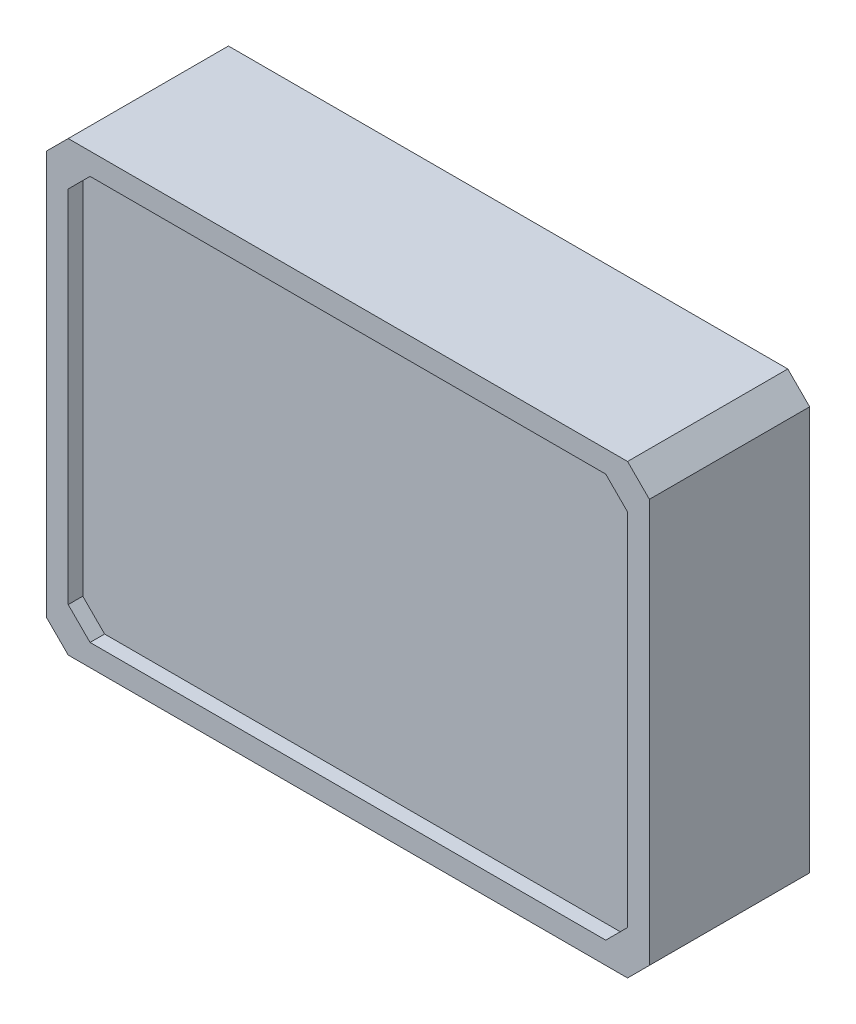
ISO-10303-21;
HEADER;
FILE_DESCRIPTION(('STEP AP214'),'2;1');
FILE_NAME('part.step','',(''),(''),'','','');
FILE_SCHEMA(('AUTOMOTIVE_DESIGN { 1 0 10303 214 1 1 1 1 }'));
ENDSEC;
DATA;
#1=APPLICATION_CONTEXT('core data for automotive mechanical design processes');
#2=APPLICATION_PROTOCOL_DEFINITION('international standard','automotive_design',2000,#1);
#3=PRODUCT_CONTEXT('',#1,'mechanical');
#4=PRODUCT('Part','Part','',(#3));
#5=PRODUCT_RELATED_PRODUCT_CATEGORY('part','',(#4));
#6=PRODUCT_DEFINITION_FORMATION('','',#4);
#7=PRODUCT_DEFINITION_CONTEXT('part definition',#1,'design');
#8=PRODUCT_DEFINITION('design','',#6,#7);
#9=PRODUCT_DEFINITION_SHAPE('','',#8);
#10=(LENGTH_UNIT() NAMED_UNIT(*) SI_UNIT(.MILLI.,.METRE.));
#11=(NAMED_UNIT(*) PLANE_ANGLE_UNIT() SI_UNIT($,.RADIAN.));
#12=(NAMED_UNIT(*) SI_UNIT($,.STERADIAN.) SOLID_ANGLE_UNIT());
#13=UNCERTAINTY_MEASURE_WITH_UNIT(LENGTH_MEASURE(1.E-05),#10,'distance_accuracy_value','');
#14=(GEOMETRIC_REPRESENTATION_CONTEXT(3) GLOBAL_UNCERTAINTY_ASSIGNED_CONTEXT((#13)) GLOBAL_UNIT_ASSIGNED_CONTEXT((#10,
#11,#12)) REPRESENTATION_CONTEXT('',''));
#15=CARTESIAN_POINT('',(0.,0.,0.));
#16=DIRECTION('',(0.,0.,1.));
#17=DIRECTION('',(1.,0.,0.));
#18=AXIS2_PLACEMENT_3D('',#15,#16,#17);
#19=CARTESIAN_POINT('',(-41.4,-27.7095,20.));
#20=DIRECTION('',(0.707106781186547,0.707106781186548,0.));
#21=DIRECTION('',(-0.707106781186548,0.707106781186547,0.));
#22=AXIS2_PLACEMENT_3D('',#19,#20,#21);
#23=PLANE('',#22);
#24=DIRECTION('',(0.707106781186548,-0.707106781186547,0.));
#25=VECTOR('',#24,1.);
#26=CARTESIAN_POINT('',(-41.4,-27.7095,0.));
#27=LINE('',#26,#25);
#28=CARTESIAN_POINT('',(-41.4,-27.7095,0.));
#29=VERTEX_POINT('',#28);
#30=CARTESIAN_POINT('',(-38.4,-30.7095,0.));
#31=VERTEX_POINT('',#30);
#32=EDGE_CURVE('E243',#29,#31,#27,.T.);
#33=ORIENTED_EDGE('',*,*,#32,.T.);
#34=DIRECTION('',(0.,0.,-1.));
#35=VECTOR('',#34,1.);
#36=CARTESIAN_POINT('',(-38.4,-30.7095,20.));
#37=LINE('',#36,#35);
#38=CARTESIAN_POINT('',(-38.4,-30.7095,22.));
#39=VERTEX_POINT('',#38);
#40=EDGE_CURVE('E11',#39,#31,#37,.T.);
#41=ORIENTED_EDGE('',*,*,#40,.F.);
#42=DIRECTION('',(0.707106781186548,-0.707106781186547,0.));
#43=VECTOR('',#42,1.);
#44=CARTESIAN_POINT('',(-41.4,-27.7095,22.));
#45=LINE('',#44,#43);
#46=CARTESIAN_POINT('',(-41.4,-27.7095,22.));
#47=VERTEX_POINT('',#46);
#48=EDGE_CURVE('E169',#47,#39,#45,.T.);
#49=ORIENTED_EDGE('',*,*,#48,.F.);
#50=DIRECTION('',(0.,0.,-1.));
#51=VECTOR('',#50,1.);
#52=CARTESIAN_POINT('',(-41.4,-27.7095,20.));
#53=LINE('',#52,#51);
#54=EDGE_CURVE('E260',#47,#29,#53,.T.);
#55=ORIENTED_EDGE('',*,*,#54,.T.);
#56=EDGE_LOOP('',(#33,#41,#49,#55));
#57=FACE_BOUND('',#56,.T.);
#58=ADVANCED_FACE('F43',(#57),#23,.F.);
#59=CARTESIAN_POINT('',(-38.4,-30.7095,20.));
#60=DIRECTION('',(0.,1.,0.));
#61=DIRECTION('',(0.,0.,1.));
#62=AXIS2_PLACEMENT_3D('',#59,#60,#61);
#63=PLANE('',#62);
#64=DIRECTION('',(1.,0.,0.));
#65=VECTOR('',#64,1.);
#66=CARTESIAN_POINT('',(-38.4,-30.7095,0.));
#67=LINE('',#66,#65);
#68=CARTESIAN_POINT('',(38.4,-30.7095,0.));
#69=VERTEX_POINT('',#68);
#70=EDGE_CURVE('E246',#31,#69,#67,.T.);
#71=ORIENTED_EDGE('',*,*,#70,.T.);
#72=DIRECTION('',(0.,0.,-1.));
#73=VECTOR('',#72,1.);
#74=CARTESIAN_POINT('',(38.4,-30.7095,20.));
#75=LINE('',#74,#73);
#76=CARTESIAN_POINT('',(38.4,-30.7095,22.));
#77=VERTEX_POINT('',#76);
#78=EDGE_CURVE('E50',#77,#69,#75,.T.);
#79=ORIENTED_EDGE('',*,*,#78,.F.);
#80=DIRECTION('',(1.,0.,0.));
#81=VECTOR('',#80,1.);
#82=CARTESIAN_POINT('',(-38.4,-30.7095,22.));
#83=LINE('',#82,#81);
#84=EDGE_CURVE('E222',#39,#77,#83,.T.);
#85=ORIENTED_EDGE('',*,*,#84,.F.);
#86=ORIENTED_EDGE('',*,*,#40,.T.);
#87=EDGE_LOOP('',(#71,#79,#85,#86));
#88=FACE_BOUND('',#87,.T.);
#89=ADVANCED_FACE('F310',(#88),#63,.F.);
#90=CARTESIAN_POINT('',(38.4,-30.7095,20.));
#91=DIRECTION('',(-0.707106781186547,0.707106781186548,0.));
#92=DIRECTION('',(-0.707106781186548,-0.707106781186547,0.));
#93=AXIS2_PLACEMENT_3D('',#90,#91,#92);
#94=PLANE('',#93);
#95=DIRECTION('',(0.707106781186548,0.707106781186547,0.));
#96=VECTOR('',#95,1.);
#97=CARTESIAN_POINT('',(38.4,-30.7095,0.));
#98=LINE('',#97,#96);
#99=CARTESIAN_POINT('',(41.4,-27.7095,0.));
#100=VERTEX_POINT('',#99);
#101=EDGE_CURVE('E248',#69,#100,#98,.T.);
#102=ORIENTED_EDGE('',*,*,#101,.T.);
#103=DIRECTION('',(0.,0.,-1.));
#104=VECTOR('',#103,1.);
#105=CARTESIAN_POINT('',(41.4,-27.7095,20.));
#106=LINE('',#105,#104);
#107=CARTESIAN_POINT('',(41.4,-27.7095,22.));
#108=VERTEX_POINT('',#107);
#109=EDGE_CURVE('E275',#108,#100,#106,.T.);
#110=ORIENTED_EDGE('',*,*,#109,.F.);
#111=DIRECTION('',(0.707106781186548,0.707106781186547,0.));
#112=VECTOR('',#111,1.);
#113=CARTESIAN_POINT('',(38.4,-30.7095,22.));
#114=LINE('',#113,#112);
#115=EDGE_CURVE('E225',#77,#108,#114,.T.);
#116=ORIENTED_EDGE('',*,*,#115,.F.);
#117=ORIENTED_EDGE('',*,*,#78,.T.);
#118=EDGE_LOOP('',(#102,#110,#116,#117));
#119=FACE_BOUND('',#118,.T.);
#120=ADVANCED_FACE('F281',(#119),#94,.F.);
#121=CARTESIAN_POINT('',(41.4,-27.7095,20.));
#122=DIRECTION('',(-1.,0.,0.));
#123=DIRECTION('',(0.,0.,1.));
#124=AXIS2_PLACEMENT_3D('',#121,#122,#123);
#125=PLANE('',#124);
#126=DIRECTION('',(0.,1.,0.));
#127=VECTOR('',#126,1.);
#128=CARTESIAN_POINT('',(41.4,-27.7095,0.));
#129=LINE('',#128,#127);
#130=CARTESIAN_POINT('',(41.4,27.7095,0.));
#131=VERTEX_POINT('',#130);
#132=EDGE_CURVE('E250',#100,#131,#129,.T.);
#133=ORIENTED_EDGE('',*,*,#132,.T.);
#134=DIRECTION('',(0.,0.,-1.));
#135=VECTOR('',#134,1.);
#136=CARTESIAN_POINT('',(41.4,27.7095,20.));
#137=LINE('',#136,#135);
#138=CARTESIAN_POINT('',(41.4,27.7095,22.));
#139=VERTEX_POINT('',#138);
#140=EDGE_CURVE('E272',#139,#131,#137,.T.);
#141=ORIENTED_EDGE('',*,*,#140,.F.);
#142=DIRECTION('',(0.,1.,0.));
#143=VECTOR('',#142,1.);
#144=CARTESIAN_POINT('',(41.4,-27.7095,22.));
#145=LINE('',#144,#143);
#146=EDGE_CURVE('E228',#108,#139,#145,.T.);
#147=ORIENTED_EDGE('',*,*,#146,.F.);
#148=ORIENTED_EDGE('',*,*,#109,.T.);
#149=EDGE_LOOP('',(#133,#141,#147,#148));
#150=FACE_BOUND('',#149,.T.);
#151=ADVANCED_FACE('F291',(#150),#125,.F.);
#152=CARTESIAN_POINT('',(41.4,27.7095,20.));
#153=DIRECTION('',(-0.707106781186547,-0.707106781186548,0.));
#154=DIRECTION('',(0.707106781186548,-0.707106781186547,0.));
#155=AXIS2_PLACEMENT_3D('',#152,#153,#154);
#156=PLANE('',#155);
#157=DIRECTION('',(-0.707106781186548,0.707106781186547,0.));
#158=VECTOR('',#157,1.);
#159=CARTESIAN_POINT('',(41.4,27.7095,0.));
#160=LINE('',#159,#158);
#161=CARTESIAN_POINT('',(38.4,30.7095,0.));
#162=VERTEX_POINT('',#161);
#163=EDGE_CURVE('E252',#131,#162,#160,.T.);
#164=ORIENTED_EDGE('',*,*,#163,.T.);
#165=DIRECTION('',(0.,0.,-1.));
#166=VECTOR('',#165,1.);
#167=CARTESIAN_POINT('',(38.4,30.7095,20.));
#168=LINE('',#167,#166);
#169=CARTESIAN_POINT('',(38.4,30.7095,22.));
#170=VERTEX_POINT('',#169);
#171=EDGE_CURVE('E269',#170,#162,#168,.T.);
#172=ORIENTED_EDGE('',*,*,#171,.F.);
#173=DIRECTION('',(-0.707106781186548,0.707106781186547,0.));
#174=VECTOR('',#173,1.);
#175=CARTESIAN_POINT('',(41.4,27.7095,22.));
#176=LINE('',#175,#174);
#177=EDGE_CURVE('E231',#139,#170,#176,.T.);
#178=ORIENTED_EDGE('',*,*,#177,.F.);
#179=ORIENTED_EDGE('',*,*,#140,.T.);
#180=EDGE_LOOP('',(#164,#172,#178,#179));
#181=FACE_BOUND('',#180,.T.);
#182=ADVANCED_FACE('F295',(#181),#156,.F.);
#183=CARTESIAN_POINT('',(38.4,30.7095,20.));
#184=DIRECTION('',(0.,-1.,0.));
#185=DIRECTION('',(0.,0.,-1.));
#186=AXIS2_PLACEMENT_3D('',#183,#184,#185);
#187=PLANE('',#186);
#188=DIRECTION('',(-1.,0.,0.));
#189=VECTOR('',#188,1.);
#190=CARTESIAN_POINT('',(38.4,30.7095,0.));
#191=LINE('',#190,#189);
#192=CARTESIAN_POINT('',(-38.4,30.7095,0.));
#193=VERTEX_POINT('',#192);
#194=EDGE_CURVE('E254',#162,#193,#191,.T.);
#195=ORIENTED_EDGE('',*,*,#194,.T.);
#196=DIRECTION('',(0.,0.,-1.));
#197=VECTOR('',#196,1.);
#198=CARTESIAN_POINT('',(-38.4,30.7095,20.));
#199=LINE('',#198,#197);
#200=CARTESIAN_POINT('',(-38.4,30.7095,22.));
#201=VERTEX_POINT('',#200);
#202=EDGE_CURVE('E266',#201,#193,#199,.T.);
#203=ORIENTED_EDGE('',*,*,#202,.F.);
#204=DIRECTION('',(-1.,0.,0.));
#205=VECTOR('',#204,1.);
#206=CARTESIAN_POINT('',(38.4,30.7095,22.));
#207=LINE('',#206,#205);
#208=EDGE_CURVE('E234',#170,#201,#207,.T.);
#209=ORIENTED_EDGE('',*,*,#208,.F.);
#210=ORIENTED_EDGE('',*,*,#171,.T.);
#211=EDGE_LOOP('',(#195,#203,#209,#210));
#212=FACE_BOUND('',#211,.T.);
#213=ADVANCED_FACE('F300',(#212),#187,.F.);
#214=CARTESIAN_POINT('',(-38.4,30.7095,20.));
#215=DIRECTION('',(0.707106781186547,-0.707106781186548,0.));
#216=DIRECTION('',(0.707106781186548,0.707106781186547,0.));
#217=AXIS2_PLACEMENT_3D('',#214,#215,#216);
#218=PLANE('',#217);
#219=DIRECTION('',(-0.707106781186548,-0.707106781186547,0.));
#220=VECTOR('',#219,1.);
#221=CARTESIAN_POINT('',(-38.4,30.7095,0.));
#222=LINE('',#221,#220);
#223=CARTESIAN_POINT('',(-41.4,27.7095,0.));
#224=VERTEX_POINT('',#223);
#225=EDGE_CURVE('E256',#193,#224,#222,.T.);
#226=ORIENTED_EDGE('',*,*,#225,.T.);
#227=DIRECTION('',(0.,0.,-1.));
#228=VECTOR('',#227,1.);
#229=CARTESIAN_POINT('',(-41.4,27.7095,20.));
#230=LINE('',#229,#228);
#231=CARTESIAN_POINT('',(-41.4,27.7095,22.));
#232=VERTEX_POINT('',#231);
#233=EDGE_CURVE('E263',#232,#224,#230,.T.);
#234=ORIENTED_EDGE('',*,*,#233,.F.);
#235=DIRECTION('',(-0.707106781186548,-0.707106781186547,0.));
#236=VECTOR('',#235,1.);
#237=CARTESIAN_POINT('',(-38.4,30.7095,22.));
#238=LINE('',#237,#236);
#239=EDGE_CURVE('E237',#201,#232,#238,.T.);
#240=ORIENTED_EDGE('',*,*,#239,.F.);
#241=ORIENTED_EDGE('',*,*,#202,.T.);
#242=EDGE_LOOP('',(#226,#234,#240,#241));
#243=FACE_BOUND('',#242,.T.);
#244=ADVANCED_FACE('F303',(#243),#218,.F.);
#245=CARTESIAN_POINT('',(-41.4,27.7095,20.));
#246=DIRECTION('',(1.,0.,0.));
#247=DIRECTION('',(0.,0.,-1.));
#248=AXIS2_PLACEMENT_3D('',#245,#246,#247);
#249=PLANE('',#248);
#250=DIRECTION('',(0.,-1.,0.));
#251=VECTOR('',#250,1.);
#252=CARTESIAN_POINT('',(-41.4,27.7095,0.));
#253=LINE('',#252,#251);
#254=EDGE_CURVE('E258',#224,#29,#253,.T.);
#255=ORIENTED_EDGE('',*,*,#254,.T.);
#256=ORIENTED_EDGE('',*,*,#54,.F.);
#257=DIRECTION('',(0.,-1.,0.));
#258=VECTOR('',#257,1.);
#259=CARTESIAN_POINT('',(-41.4,27.7095,22.));
#260=LINE('',#259,#258);
#261=EDGE_CURVE('E240',#232,#47,#260,.T.);
#262=ORIENTED_EDGE('',*,*,#261,.F.);
#263=ORIENTED_EDGE('',*,*,#233,.T.);
#264=EDGE_LOOP('',(#255,#256,#262,#263));
#265=FACE_BOUND('',#264,.T.);
#266=ADVANCED_FACE('F306',(#265),#249,.F.);
#267=CARTESIAN_POINT('',(0.,0.,0.));
#268=DIRECTION('',(0.,0.,1.));
#269=DIRECTION('',(1.,0.,0.));
#270=AXIS2_PLACEMENT_3D('',#267,#268,#269);
#271=PLANE('',#270);
#272=ORIENTED_EDGE('',*,*,#32,.F.);
#273=ORIENTED_EDGE('',*,*,#254,.F.);
#274=ORIENTED_EDGE('',*,*,#225,.F.);
#275=ORIENTED_EDGE('',*,*,#194,.F.);
#276=ORIENTED_EDGE('',*,*,#163,.F.);
#277=ORIENTED_EDGE('',*,*,#132,.F.);
#278=ORIENTED_EDGE('',*,*,#101,.F.);
#279=ORIENTED_EDGE('',*,*,#70,.F.);
#280=EDGE_LOOP('',(#272,#273,#274,#275,#276,#277,#278,#279));
#281=FACE_BOUND('',#280,.T.);
#282=ADVANCED_FACE('F287',(#281),#271,.F.);
#283=CARTESIAN_POINT('',(0.,0.,22.));
#284=DIRECTION('',(0.,0.,1.));
#285=DIRECTION('',(1.,0.,0.));
#286=AXIS2_PLACEMENT_3D('',#283,#284,#285);
#287=PLANE('',#286);
#288=ORIENTED_EDGE('',*,*,#48,.T.);
#289=ORIENTED_EDGE('',*,*,#84,.T.);
#290=ORIENTED_EDGE('',*,*,#115,.T.);
#291=ORIENTED_EDGE('',*,*,#146,.T.);
#292=ORIENTED_EDGE('',*,*,#177,.T.);
#293=ORIENTED_EDGE('',*,*,#208,.T.);
#294=ORIENTED_EDGE('',*,*,#239,.T.);
#295=ORIENTED_EDGE('',*,*,#261,.T.);
#296=EDGE_LOOP('',(#288,#289,#290,#291,#292,#293,#294,#295));
#297=FACE_BOUND('',#296,.T.);
#298=DIRECTION('',(1.,0.,0.));
#299=VECTOR('',#298,1.);
#300=CARTESIAN_POINT('',(-35.4,-27.7095,22.));
#301=LINE('',#300,#299);
#302=CARTESIAN_POINT('',(-35.4,-27.7095,22.));
#303=VERTEX_POINT('',#302);
#304=CARTESIAN_POINT('',(35.4,-27.7095,22.));
#305=VERTEX_POINT('',#304);
#306=EDGE_CURVE('E163',#303,#305,#301,.T.);
#307=ORIENTED_EDGE('',*,*,#306,.F.);
#308=DIRECTION('',(0.707106781186547,-0.707106781186548,0.));
#309=VECTOR('',#308,1.);
#310=CARTESIAN_POINT('',(-38.4,-24.7095,22.));
#311=LINE('',#310,#309);
#312=CARTESIAN_POINT('',(-38.4,-24.7095,22.));
#313=VERTEX_POINT('',#312);
#314=EDGE_CURVE('E154',#313,#303,#311,.T.);
#315=ORIENTED_EDGE('',*,*,#314,.F.);
#316=DIRECTION('',(0.,-1.,0.));
#317=VECTOR('',#316,1.);
#318=CARTESIAN_POINT('',(-38.4,24.7095,22.));
#319=LINE('',#318,#317);
#320=CARTESIAN_POINT('',(-38.4,24.7095,22.));
#321=VERTEX_POINT('',#320);
#322=EDGE_CURVE('E188',#321,#313,#319,.T.);
#323=ORIENTED_EDGE('',*,*,#322,.F.);
#324=DIRECTION('',(-0.707106781186547,-0.707106781186548,0.));
#325=VECTOR('',#324,1.);
#326=CARTESIAN_POINT('',(-35.4,27.7095,22.));
#327=LINE('',#326,#325);
#328=CARTESIAN_POINT('',(-35.4,27.7095,22.));
#329=VERTEX_POINT('',#328);
#330=EDGE_CURVE('E185',#329,#321,#327,.T.);
#331=ORIENTED_EDGE('',*,*,#330,.F.);
#332=DIRECTION('',(-1.,0.,0.));
#333=VECTOR('',#332,1.);
#334=CARTESIAN_POINT('',(35.4,27.7095,22.));
#335=LINE('',#334,#333);
#336=CARTESIAN_POINT('',(35.4,27.7095,22.));
#337=VERTEX_POINT('',#336);
#338=EDGE_CURVE('E183',#337,#329,#335,.T.);
#339=ORIENTED_EDGE('',*,*,#338,.F.);
#340=DIRECTION('',(-0.707106781186547,0.707106781186548,0.));
#341=VECTOR('',#340,1.);
#342=CARTESIAN_POINT('',(38.4,24.7095,22.));
#343=LINE('',#342,#341);
#344=CARTESIAN_POINT('',(38.4,24.7095,22.));
#345=VERTEX_POINT('',#344);
#346=EDGE_CURVE('E181',#345,#337,#343,.T.);
#347=ORIENTED_EDGE('',*,*,#346,.F.);
#348=DIRECTION('',(0.,1.,0.));
#349=VECTOR('',#348,1.);
#350=CARTESIAN_POINT('',(38.4,-24.7095,22.));
#351=LINE('',#350,#349);
#352=CARTESIAN_POINT('',(38.4,-24.7095,22.));
#353=VERTEX_POINT('',#352);
#354=EDGE_CURVE('E177',#353,#345,#351,.T.);
#355=ORIENTED_EDGE('',*,*,#354,.F.);
#356=DIRECTION('',(0.707106781186547,0.707106781186548,0.));
#357=VECTOR('',#356,1.);
#358=CARTESIAN_POINT('',(35.4,-27.7095,22.));
#359=LINE('',#358,#357);
#360=EDGE_CURVE('E175',#305,#353,#359,.T.);
#361=ORIENTED_EDGE('',*,*,#360,.F.);
#362=EDGE_LOOP('',(#307,#315,#323,#331,#339,#347,#355,#361));
#363=FACE_BOUND('',#362,.T.);
#364=ADVANCED_FACE('F173',(#297,#363),#287,.T.);
#365=CARTESIAN_POINT('',(-38.4,-24.7095,22.));
#366=DIRECTION('',(0.707106781186548,0.707106781186547,0.));
#367=DIRECTION('',(-0.707106781186547,0.707106781186548,0.));
#368=AXIS2_PLACEMENT_3D('',#365,#366,#367);
#369=PLANE('',#368);
#370=DIRECTION('',(0.707106781186547,-0.707106781186548,0.));
#371=VECTOR('',#370,1.);
#372=CARTESIAN_POINT('',(-38.4,-24.7095,20.));
#373=LINE('',#372,#371);
#374=CARTESIAN_POINT('',(-38.4,-24.7095,20.));
#375=VERTEX_POINT('',#374);
#376=CARTESIAN_POINT('',(-35.4,-27.7095,20.));
#377=VERTEX_POINT('',#376);
#378=EDGE_CURVE('E57',#375,#377,#373,.T.);
#379=ORIENTED_EDGE('',*,*,#378,.F.);
#380=DIRECTION('',(0.,0.,-1.));
#381=VECTOR('',#380,1.);
#382=CARTESIAN_POINT('',(-38.4,-24.7095,22.));
#383=LINE('',#382,#381);
#384=EDGE_CURVE('E159',#313,#375,#383,.T.);
#385=ORIENTED_EDGE('',*,*,#384,.F.);
#386=ORIENTED_EDGE('',*,*,#314,.T.);
#387=DIRECTION('',(0.,0.,-1.));
#388=VECTOR('',#387,1.);
#389=CARTESIAN_POINT('',(-35.4,-27.7095,22.));
#390=LINE('',#389,#388);
#391=EDGE_CURVE('E157',#303,#377,#390,.T.);
#392=ORIENTED_EDGE('',*,*,#391,.T.);
#393=EDGE_LOOP('',(#379,#385,#386,#392));
#394=FACE_BOUND('',#393,.T.);
#395=ADVANCED_FACE('F156',(#394),#369,.T.);
#396=CARTESIAN_POINT('',(-35.4,-27.7095,22.));
#397=DIRECTION('',(0.,1.,0.));
#398=DIRECTION('',(0.,0.,1.));
#399=AXIS2_PLACEMENT_3D('',#396,#397,#398);
#400=PLANE('',#399);
#401=DIRECTION('',(1.,0.,0.));
#402=VECTOR('',#401,1.);
#403=CARTESIAN_POINT('',(-35.4,-27.7095,20.));
#404=LINE('',#403,#402);
#405=CARTESIAN_POINT('',(35.4,-27.7095,20.));
#406=VERTEX_POINT('',#405);
#407=EDGE_CURVE('E61',#377,#406,#404,.T.);
#408=ORIENTED_EDGE('',*,*,#407,.F.);
#409=ORIENTED_EDGE('',*,*,#391,.F.);
#410=ORIENTED_EDGE('',*,*,#306,.T.);
#411=DIRECTION('',(0.,0.,-1.));
#412=VECTOR('',#411,1.);
#413=CARTESIAN_POINT('',(35.4,-27.7095,22.));
#414=LINE('',#413,#412);
#415=EDGE_CURVE('E170',#305,#406,#414,.T.);
#416=ORIENTED_EDGE('',*,*,#415,.T.);
#417=EDGE_LOOP('',(#408,#409,#410,#416));
#418=FACE_BOUND('',#417,.T.);
#419=ADVANCED_FACE('F167',(#418),#400,.T.);
#420=CARTESIAN_POINT('',(35.4,-27.7095,22.));
#421=DIRECTION('',(-0.707106781186548,0.707106781186547,0.));
#422=DIRECTION('',(-0.707106781186547,-0.707106781186548,0.));
#423=AXIS2_PLACEMENT_3D('',#420,#421,#422);
#424=PLANE('',#423);
#425=DIRECTION('',(0.707106781186547,0.707106781186548,0.));
#426=VECTOR('',#425,1.);
#427=CARTESIAN_POINT('',(35.4,-27.7095,20.));
#428=LINE('',#427,#426);
#429=CARTESIAN_POINT('',(38.4,-24.7095,20.));
#430=VERTEX_POINT('',#429);
#431=EDGE_CURVE('E192',#406,#430,#428,.T.);
#432=ORIENTED_EDGE('',*,*,#431,.F.);
#433=ORIENTED_EDGE('',*,*,#415,.F.);
#434=ORIENTED_EDGE('',*,*,#360,.T.);
#435=DIRECTION('',(0.,0.,-1.));
#436=VECTOR('',#435,1.);
#437=CARTESIAN_POINT('',(38.4,-24.7095,22.));
#438=LINE('',#437,#436);
#439=EDGE_CURVE('E216',#353,#430,#438,.T.);
#440=ORIENTED_EDGE('',*,*,#439,.T.);
#441=EDGE_LOOP('',(#432,#433,#434,#440));
#442=FACE_BOUND('',#441,.T.);
#443=ADVANCED_FACE('F340',(#442),#424,.T.);
#444=CARTESIAN_POINT('',(38.4,-24.7095,22.));
#445=DIRECTION('',(-1.,0.,0.));
#446=DIRECTION('',(0.,0.,1.));
#447=AXIS2_PLACEMENT_3D('',#444,#445,#446);
#448=PLANE('',#447);
#449=DIRECTION('',(0.,1.,0.));
#450=VECTOR('',#449,1.);
#451=CARTESIAN_POINT('',(38.4,-24.7095,20.));
#452=LINE('',#451,#450);
#453=CARTESIAN_POINT('',(38.4,24.7095,20.));
#454=VERTEX_POINT('',#453);
#455=EDGE_CURVE('E194',#430,#454,#452,.T.);
#456=ORIENTED_EDGE('',*,*,#455,.F.);
#457=ORIENTED_EDGE('',*,*,#439,.F.);
#458=ORIENTED_EDGE('',*,*,#354,.T.);
#459=DIRECTION('',(0.,0.,-1.));
#460=VECTOR('',#459,1.);
#461=CARTESIAN_POINT('',(38.4,24.7095,22.));
#462=LINE('',#461,#460);
#463=EDGE_CURVE('E213',#345,#454,#462,.T.);
#464=ORIENTED_EDGE('',*,*,#463,.T.);
#465=EDGE_LOOP('',(#456,#457,#458,#464));
#466=FACE_BOUND('',#465,.T.);
#467=ADVANCED_FACE('F343',(#466),#448,.T.);
#468=CARTESIAN_POINT('',(38.4,24.7095,22.));
#469=DIRECTION('',(-0.707106781186548,-0.707106781186547,0.));
#470=DIRECTION('',(0.707106781186547,-0.707106781186548,0.));
#471=AXIS2_PLACEMENT_3D('',#468,#469,#470);
#472=PLANE('',#471);
#473=DIRECTION('',(-0.707106781186547,0.707106781186548,0.));
#474=VECTOR('',#473,1.);
#475=CARTESIAN_POINT('',(38.4,24.7095,20.));
#476=LINE('',#475,#474);
#477=CARTESIAN_POINT('',(35.4,27.7095,20.));
#478=VERTEX_POINT('',#477);
#479=EDGE_CURVE('E196',#454,#478,#476,.T.);
#480=ORIENTED_EDGE('',*,*,#479,.F.);
#481=ORIENTED_EDGE('',*,*,#463,.F.);
#482=ORIENTED_EDGE('',*,*,#346,.T.);
#483=DIRECTION('',(0.,0.,-1.));
#484=VECTOR('',#483,1.);
#485=CARTESIAN_POINT('',(35.4,27.7095,22.));
#486=LINE('',#485,#484);
#487=EDGE_CURVE('E210',#337,#478,#486,.T.);
#488=ORIENTED_EDGE('',*,*,#487,.T.);
#489=EDGE_LOOP('',(#480,#481,#482,#488));
#490=FACE_BOUND('',#489,.T.);
#491=ADVANCED_FACE('F347',(#490),#472,.T.);
#492=CARTESIAN_POINT('',(35.4,27.7095,22.));
#493=DIRECTION('',(0.,-1.,0.));
#494=DIRECTION('',(0.,0.,-1.));
#495=AXIS2_PLACEMENT_3D('',#492,#493,#494);
#496=PLANE('',#495);
#497=DIRECTION('',(-1.,0.,0.));
#498=VECTOR('',#497,1.);
#499=CARTESIAN_POINT('',(35.4,27.7095,20.));
#500=LINE('',#499,#498);
#501=CARTESIAN_POINT('',(-35.4,27.7095,20.));
#502=VERTEX_POINT('',#501);
#503=EDGE_CURVE('E198',#478,#502,#500,.T.);
#504=ORIENTED_EDGE('',*,*,#503,.F.);
#505=ORIENTED_EDGE('',*,*,#487,.F.);
#506=ORIENTED_EDGE('',*,*,#338,.T.);
#507=DIRECTION('',(0.,0.,-1.));
#508=VECTOR('',#507,1.);
#509=CARTESIAN_POINT('',(-35.4,27.7095,22.));
#510=LINE('',#509,#508);
#511=EDGE_CURVE('E207',#329,#502,#510,.T.);
#512=ORIENTED_EDGE('',*,*,#511,.T.);
#513=EDGE_LOOP('',(#504,#505,#506,#512));
#514=FACE_BOUND('',#513,.T.);
#515=ADVANCED_FACE('F351',(#514),#496,.T.);
#516=CARTESIAN_POINT('',(-35.4,27.7095,22.));
#517=DIRECTION('',(0.707106781186548,-0.707106781186547,0.));
#518=DIRECTION('',(0.707106781186547,0.707106781186548,0.));
#519=AXIS2_PLACEMENT_3D('',#516,#517,#518);
#520=PLANE('',#519);
#521=DIRECTION('',(-0.707106781186547,-0.707106781186548,0.));
#522=VECTOR('',#521,1.);
#523=CARTESIAN_POINT('',(-35.4,27.7095,20.));
#524=LINE('',#523,#522);
#525=CARTESIAN_POINT('',(-38.4,24.7095,20.));
#526=VERTEX_POINT('',#525);
#527=EDGE_CURVE('E200',#502,#526,#524,.T.);
#528=ORIENTED_EDGE('',*,*,#527,.F.);
#529=ORIENTED_EDGE('',*,*,#511,.F.);
#530=ORIENTED_EDGE('',*,*,#330,.T.);
#531=DIRECTION('',(0.,0.,-1.));
#532=VECTOR('',#531,1.);
#533=CARTESIAN_POINT('',(-38.4,24.7095,22.));
#534=LINE('',#533,#532);
#535=EDGE_CURVE('E204',#321,#526,#534,.T.);
#536=ORIENTED_EDGE('',*,*,#535,.T.);
#537=EDGE_LOOP('',(#528,#529,#530,#536));
#538=FACE_BOUND('',#537,.T.);
#539=ADVANCED_FACE('F355',(#538),#520,.T.);
#540=CARTESIAN_POINT('',(-38.4,24.7095,22.));
#541=DIRECTION('',(1.,0.,0.));
#542=DIRECTION('',(0.,0.,-1.));
#543=AXIS2_PLACEMENT_3D('',#540,#541,#542);
#544=PLANE('',#543);
#545=DIRECTION('',(0.,-1.,0.));
#546=VECTOR('',#545,1.);
#547=CARTESIAN_POINT('',(-38.4,24.7095,20.));
#548=LINE('',#547,#546);
#549=EDGE_CURVE('E164',#526,#375,#548,.T.);
#550=ORIENTED_EDGE('',*,*,#549,.F.);
#551=ORIENTED_EDGE('',*,*,#535,.F.);
#552=ORIENTED_EDGE('',*,*,#322,.T.);
#553=ORIENTED_EDGE('',*,*,#384,.T.);
#554=EDGE_LOOP('',(#550,#551,#552,#553));
#555=FACE_BOUND('',#554,.T.);
#556=ADVANCED_FACE('F333',(#555),#544,.T.);
#557=CARTESIAN_POINT('',(0.,0.,20.));
#558=DIRECTION('',(0.,0.,1.));
#559=DIRECTION('',(1.,0.,0.));
#560=AXIS2_PLACEMENT_3D('',#557,#558,#559);
#561=PLANE('',#560);
#562=ORIENTED_EDGE('',*,*,#378,.T.);
#563=ORIENTED_EDGE('',*,*,#407,.T.);
#564=ORIENTED_EDGE('',*,*,#431,.T.);
#565=ORIENTED_EDGE('',*,*,#455,.T.);
#566=ORIENTED_EDGE('',*,*,#479,.T.);
#567=ORIENTED_EDGE('',*,*,#503,.T.);
#568=ORIENTED_EDGE('',*,*,#527,.T.);
#569=ORIENTED_EDGE('',*,*,#549,.T.);
#570=EDGE_LOOP('',(#562,#563,#564,#565,#566,#567,#568,#569));
#571=FACE_BOUND('',#570,.T.);
#572=ADVANCED_FACE('F330',(#571),#561,.T.);
#573=CLOSED_SHELL('',(#58,#89,#120,#151,#182,#213,#244,#266,#282,#364,#395,#419,#443,#467,#491,
#515,#539,#556,#572));
#574=MANIFOLD_SOLID_BREP('B2',#573);
#575=ADVANCED_BREP_SHAPE_REPRESENTATION('',(#18,#574),#14);
#576=SHAPE_DEFINITION_REPRESENTATION(#9,#575);
ENDSEC;
END-ISO-10303-21;
